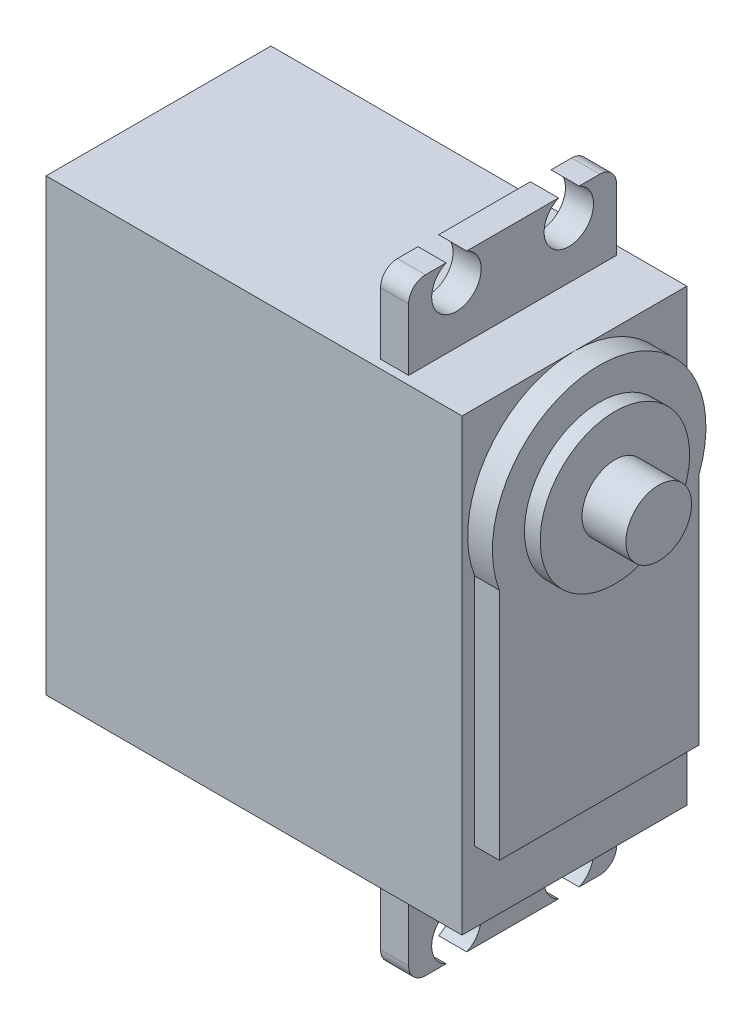
ISO-10303-21;
HEADER;
FILE_DESCRIPTION(('STEP AP214'),'2;1');
FILE_NAME('part.step','',(''),(''),'','','');
FILE_SCHEMA(('AUTOMOTIVE_DESIGN { 1 0 10303 214 1 1 1 1 }'));
ENDSEC;
DATA;
#1=APPLICATION_CONTEXT('core data for automotive mechanical design processes');
#2=APPLICATION_PROTOCOL_DEFINITION('international standard','automotive_design',2000,#1);
#3=PRODUCT_CONTEXT('',#1,'mechanical');
#4=PRODUCT('Part','Part','',(#3));
#5=PRODUCT_RELATED_PRODUCT_CATEGORY('part','',(#4));
#6=PRODUCT_DEFINITION_FORMATION('','',#4);
#7=PRODUCT_DEFINITION_CONTEXT('part definition',#1,'design');
#8=PRODUCT_DEFINITION('design','',#6,#7);
#9=PRODUCT_DEFINITION_SHAPE('','',#8);
#10=(LENGTH_UNIT() NAMED_UNIT(*) SI_UNIT(.MILLI.,.METRE.));
#11=(NAMED_UNIT(*) PLANE_ANGLE_UNIT() SI_UNIT($,.RADIAN.));
#12=(NAMED_UNIT(*) SI_UNIT($,.STERADIAN.) SOLID_ANGLE_UNIT());
#13=UNCERTAINTY_MEASURE_WITH_UNIT(LENGTH_MEASURE(1.E-05),#10,'distance_accuracy_value','');
#14=(GEOMETRIC_REPRESENTATION_CONTEXT(3) GLOBAL_UNCERTAINTY_ASSIGNED_CONTEXT((#13)) GLOBAL_UNIT_ASSIGNED_CONTEXT((#10,
#11,#12)) REPRESENTATION_CONTEXT('',''));
#15=CARTESIAN_POINT('',(0.,0.,0.));
#16=DIRECTION('',(0.,0.,1.));
#17=DIRECTION('',(1.,0.,0.));
#18=AXIS2_PLACEMENT_3D('',#15,#16,#17);
#19=CARTESIAN_POINT('',(18.5,20.,-20.));
#20=DIRECTION('',(1.,0.,0.));
#21=DIRECTION('',(0.,0.,-1.));
#22=AXIS2_PLACEMENT_3D('',#19,#20,#21);
#23=PLANE('',#22);
#24=CARTESIAN_POINT('',(18.5,10.5,-9.99999999999999));
#25=DIRECTION('',(1.,0.,0.));
#26=DIRECTION('',(0.,0.,-1.));
#27=AXIS2_PLACEMENT_3D('',#24,#25,#26);
#28=CIRCLE('',#27,9.5);
#29=CARTESIAN_POINT('',(18.5,7.11113957206849,-18.875));
#30=VERTEX_POINT('',#29);
#31=CARTESIAN_POINT('',(18.5,20.,-9.99999999999999));
#32=VERTEX_POINT('',#31);
#33=EDGE_CURVE('E279',#30,#32,#28,.T.);
#34=ORIENTED_EDGE('',*,*,#33,.F.);
#35=DIRECTION('',(0.,1.,0.));
#36=VECTOR('',#35,1.);
#37=CARTESIAN_POINT('',(18.5,-13.7,-18.875));
#38=LINE('',#37,#36);
#39=CARTESIAN_POINT('',(18.5,-13.7,-18.875));
#40=VERTEX_POINT('',#39);
#41=EDGE_CURVE('E265',#40,#30,#38,.T.);
#42=ORIENTED_EDGE('',*,*,#41,.F.);
#43=DIRECTION('',(0.,0.,-1.));
#44=VECTOR('',#43,1.);
#45=CARTESIAN_POINT('',(18.5,-13.7,-1.12499999999999));
#46=LINE('',#45,#44);
#47=CARTESIAN_POINT('',(18.5,-13.7,-1.12499999999999));
#48=VERTEX_POINT('',#47);
#49=EDGE_CURVE('E271',#48,#40,#46,.T.);
#50=ORIENTED_EDGE('',*,*,#49,.F.);
#51=DIRECTION('',(0.,-1.,0.));
#52=VECTOR('',#51,1.);
#53=CARTESIAN_POINT('',(18.5,-13.7,-1.12499999999999));
#54=LINE('',#53,#52);
#55=CARTESIAN_POINT('',(18.5,7.11113957206851,-1.12499999999999));
#56=VERTEX_POINT('',#55);
#57=EDGE_CURVE('E250',#56,#48,#54,.T.);
#58=ORIENTED_EDGE('',*,*,#57,.F.);
#59=EDGE_CURVE('E283',#32,#56,#28,.T.);
#60=ORIENTED_EDGE('',*,*,#59,.F.);
#61=DIRECTION('',(0.,0.,1.));
#62=VECTOR('',#61,1.);
#63=CARTESIAN_POINT('',(18.5,20.,-20.));
#64=LINE('',#63,#62);
#65=CARTESIAN_POINT('',(18.5,20.,0.));
#66=VERTEX_POINT('',#65);
#67=EDGE_CURVE('E413',#32,#66,#64,.T.);
#68=ORIENTED_EDGE('',*,*,#67,.T.);
#69=DIRECTION('',(0.,1.,0.));
#70=VECTOR('',#69,1.);
#71=CARTESIAN_POINT('',(18.5,20.,0.));
#72=LINE('',#71,#70);
#73=CARTESIAN_POINT('',(18.5,-20.,0.));
#74=VERTEX_POINT('',#73);
#75=EDGE_CURVE('E395',#74,#66,#72,.T.);
#76=ORIENTED_EDGE('',*,*,#75,.F.);
#77=DIRECTION('',(0.,0.,1.));
#78=VECTOR('',#77,1.);
#79=CARTESIAN_POINT('',(18.5,-20.,-20.));
#80=LINE('',#79,#78);
#81=CARTESIAN_POINT('',(18.5,-20.,-20.));
#82=VERTEX_POINT('',#81);
#83=EDGE_CURVE('E428',#82,#74,#80,.T.);
#84=ORIENTED_EDGE('',*,*,#83,.F.);
#85=DIRECTION('',(0.,1.,0.));
#86=VECTOR('',#85,1.);
#87=CARTESIAN_POINT('',(18.5,20.,-20.));
#88=LINE('',#87,#86);
#89=CARTESIAN_POINT('',(18.5,20.,-20.));
#90=VERTEX_POINT('',#89);
#91=EDGE_CURVE('E396',#82,#90,#88,.T.);
#92=ORIENTED_EDGE('',*,*,#91,.T.);
#93=EDGE_CURVE('E438',#90,#32,#64,.T.);
#94=ORIENTED_EDGE('',*,*,#93,.T.);
#95=EDGE_LOOP('',(#34,#42,#50,#58,#60,#68,#76,#84,#92,#94));
#96=FACE_BOUND('',#95,.T.);
#97=ADVANCED_FACE('F45',(#96),#23,.T.);
#98=CARTESIAN_POINT('',(20.7,10.5,-9.99999999999999));
#99=DIRECTION('',(-1.,0.,0.));
#100=DIRECTION('',(0.,0.,1.));
#101=AXIS2_PLACEMENT_3D('',#98,#99,#100);
#102=CYLINDRICAL_SURFACE('',#101,9.5);
#103=DIRECTION('',(-1.,0.,0.));
#104=VECTOR('',#103,1.);
#105=CARTESIAN_POINT('',(20.7,7.11113957206849,-18.875));
#106=LINE('',#105,#104);
#107=CARTESIAN_POINT('',(20.7,7.11113957206849,-18.875));
#108=VERTEX_POINT('',#107);
#109=EDGE_CURVE('E276',#30,#108,#106,.F.);
#110=ORIENTED_EDGE('',*,*,#109,.F.);
#111=ORIENTED_EDGE('',*,*,#33,.T.);
#112=ORIENTED_EDGE('',*,*,#59,.T.);
#113=DIRECTION('',(-1.,0.,0.));
#114=VECTOR('',#113,1.);
#115=CARTESIAN_POINT('',(20.7,7.11113957206851,-1.12499999999999));
#116=LINE('',#115,#114);
#117=CARTESIAN_POINT('',(20.7,7.11113957206851,-1.12499999999999));
#118=VERTEX_POINT('',#117);
#119=EDGE_CURVE('E254',#118,#56,#116,.T.);
#120=ORIENTED_EDGE('',*,*,#119,.F.);
#121=CARTESIAN_POINT('',(20.7,10.5,-9.99999999999999));
#122=DIRECTION('',(1.,0.,0.));
#123=DIRECTION('',(0.,0.,-1.));
#124=AXIS2_PLACEMENT_3D('',#121,#122,#123);
#125=CIRCLE('',#124,9.5);
#126=EDGE_CURVE('E241',#108,#118,#125,.T.);
#127=ORIENTED_EDGE('',*,*,#126,.F.);
#128=EDGE_LOOP('',(#110,#111,#112,#120,#127));
#129=FACE_BOUND('',#128,.T.);
#130=ADVANCED_FACE('F554',(#129),#102,.T.);
#131=CARTESIAN_POINT('',(13.,27.,-19.25));
#132=DIRECTION('',(0.,1.,0.));
#133=DIRECTION('',(-1.,0.,0.));
#134=AXIS2_PLACEMENT_3D('',#131,#132,#133);
#135=PLANE('',#134);
#136=DIRECTION('',(1.,0.,0.));
#137=VECTOR('',#136,1.);
#138=CARTESIAN_POINT('',(-18.501,27.,-14.0834848610088));
#139=LINE('',#138,#137);
#140=CARTESIAN_POINT('',(13.,27.,-14.0834848610088));
#141=VERTEX_POINT('',#140);
#142=CARTESIAN_POINT('',(10.5,27.,-14.0834848610088));
#143=VERTEX_POINT('',#142);
#144=EDGE_CURVE('E71',#141,#143,#139,.F.);
#145=ORIENTED_EDGE('',*,*,#144,.T.);
#146=DIRECTION('',(0.,0.,-1.));
#147=VECTOR('',#146,1.);
#148=CARTESIAN_POINT('',(10.5,27.,-19.25));
#149=LINE('',#148,#147);
#150=CARTESIAN_POINT('',(10.5,27.,-5.91651513899118));
#151=VERTEX_POINT('',#150);
#152=EDGE_CURVE('E371',#151,#143,#149,.T.);
#153=ORIENTED_EDGE('',*,*,#152,.F.);
#154=DIRECTION('',(1.,0.,0.));
#155=VECTOR('',#154,1.);
#156=CARTESIAN_POINT('',(-18.501,27.,-5.91651513899118));
#157=LINE('',#156,#155);
#158=CARTESIAN_POINT('',(13.,27.,-5.91651513899118));
#159=VERTEX_POINT('',#158);
#160=EDGE_CURVE('E314',#151,#159,#157,.T.);
#161=ORIENTED_EDGE('',*,*,#160,.T.);
#162=DIRECTION('',(0.,0.,-1.));
#163=VECTOR('',#162,1.);
#164=CARTESIAN_POINT('',(13.,27.,-19.25));
#165=LINE('',#164,#163);
#166=EDGE_CURVE('E351',#159,#141,#165,.T.);
#167=ORIENTED_EDGE('',*,*,#166,.T.);
#168=EDGE_LOOP('',(#145,#153,#161,#167));
#169=FACE_BOUND('',#168,.T.);
#170=ADVANCED_FACE('F561',(#169),#135,.T.);
#171=DIRECTION('',(1.,0.,0.));
#172=VECTOR('',#171,1.);
#173=CARTESIAN_POINT('',(-18.501,27.,-4.08348486100881));
#174=LINE('',#173,#172);
#175=CARTESIAN_POINT('',(13.,27.,-4.08348486100881));
#176=VERTEX_POINT('',#175);
#177=CARTESIAN_POINT('',(10.5,27.,-4.08348486100881));
#178=VERTEX_POINT('',#177);
#179=EDGE_CURVE('E330',#176,#178,#174,.F.);
#180=ORIENTED_EDGE('',*,*,#179,.T.);
#181=CARTESIAN_POINT('',(10.5,27.,-2.25));
#182=VERTEX_POINT('',#181);
#183=EDGE_CURVE('E366',#182,#178,#149,.T.);
#184=ORIENTED_EDGE('',*,*,#183,.F.);
#185=DIRECTION('',(-1.,0.,0.));
#186=VECTOR('',#185,1.);
#187=CARTESIAN_POINT('',(13.,27.,-2.25));
#188=LINE('',#187,#186);
#189=CARTESIAN_POINT('',(13.,27.,-2.25));
#190=VERTEX_POINT('',#189);
#191=EDGE_CURVE('E483',#182,#190,#188,.F.);
#192=ORIENTED_EDGE('',*,*,#191,.T.);
#193=EDGE_CURVE('E346',#190,#176,#165,.T.);
#194=ORIENTED_EDGE('',*,*,#193,.T.);
#195=EDGE_LOOP('',(#180,#184,#192,#194));
#196=FACE_BOUND('',#195,.T.);
#197=ADVANCED_FACE('F663',(#196),#135,.T.);
#198=CARTESIAN_POINT('',(13.,-27.,-19.25));
#199=DIRECTION('',(0.,-1.,0.));
#200=DIRECTION('',(1.,0.,0.));
#201=AXIS2_PLACEMENT_3D('',#198,#199,#200);
#202=PLANE('',#201);
#203=DIRECTION('',(1.,0.,0.));
#204=VECTOR('',#203,1.);
#205=CARTESIAN_POINT('',(-18.501,-27.,-5.91651513899117));
#206=LINE('',#205,#204);
#207=CARTESIAN_POINT('',(13.,-27.,-5.91651513899117));
#208=VERTEX_POINT('',#207);
#209=CARTESIAN_POINT('',(10.5,-27.,-5.91651513899117));
#210=VERTEX_POINT('',#209);
#211=EDGE_CURVE('E320',#208,#210,#206,.F.);
#212=ORIENTED_EDGE('',*,*,#211,.T.);
#213=DIRECTION('',(0.,0.,1.));
#214=VECTOR('',#213,1.);
#215=CARTESIAN_POINT('',(10.5,-27.,-19.25));
#216=LINE('',#215,#214);
#217=CARTESIAN_POINT('',(10.5,-27.,-14.0834848610088));
#218=VERTEX_POINT('',#217);
#219=EDGE_CURVE('E380',#218,#210,#216,.T.);
#220=ORIENTED_EDGE('',*,*,#219,.F.);
#221=DIRECTION('',(1.,0.,0.));
#222=VECTOR('',#221,1.);
#223=CARTESIAN_POINT('',(-18.501,-27.,-14.0834848610088));
#224=LINE('',#223,#222);
#225=CARTESIAN_POINT('',(13.,-27.,-14.0834848610088));
#226=VERTEX_POINT('',#225);
#227=EDGE_CURVE('E296',#218,#226,#224,.T.);
#228=ORIENTED_EDGE('',*,*,#227,.T.);
#229=DIRECTION('',(0.,0.,1.));
#230=VECTOR('',#229,1.);
#231=CARTESIAN_POINT('',(13.,-27.,-19.25));
#232=LINE('',#231,#230);
#233=EDGE_CURVE('E361',#226,#208,#232,.T.);
#234=ORIENTED_EDGE('',*,*,#233,.T.);
#235=EDGE_LOOP('',(#212,#220,#228,#234));
#236=FACE_BOUND('',#235,.T.);
#237=ADVANCED_FACE('F653',(#236),#202,.T.);
#238=DIRECTION('',(1.,0.,0.));
#239=VECTOR('',#238,1.);
#240=CARTESIAN_POINT('',(-18.501,-27.,-15.9165151389912));
#241=LINE('',#240,#239);
#242=CARTESIAN_POINT('',(13.,-27.,-15.9165151389912));
#243=VERTEX_POINT('',#242);
#244=CARTESIAN_POINT('',(10.5,-27.,-15.9165151389912));
#245=VERTEX_POINT('',#244);
#246=EDGE_CURVE('E292',#243,#245,#241,.F.);
#247=ORIENTED_EDGE('',*,*,#246,.T.);
#248=CARTESIAN_POINT('',(10.5,-27.,-17.75));
#249=VERTEX_POINT('',#248);
#250=EDGE_CURVE('E376',#249,#245,#216,.T.);
#251=ORIENTED_EDGE('',*,*,#250,.F.);
#252=DIRECTION('',(-1.,0.,0.));
#253=VECTOR('',#252,1.);
#254=CARTESIAN_POINT('',(13.,-27.,-17.75));
#255=LINE('',#254,#253);
#256=CARTESIAN_POINT('',(13.,-27.,-17.75));
#257=VERTEX_POINT('',#256);
#258=EDGE_CURVE('E456',#249,#257,#255,.F.);
#259=ORIENTED_EDGE('',*,*,#258,.T.);
#260=EDGE_CURVE('E356',#257,#243,#232,.T.);
#261=ORIENTED_EDGE('',*,*,#260,.T.);
#262=EDGE_LOOP('',(#247,#251,#259,#261));
#263=FACE_BOUND('',#262,.T.);
#264=ADVANCED_FACE('F654',(#263),#202,.T.);
#265=CARTESIAN_POINT('',(-18.5,-20.,-20.));
#266=DIRECTION('',(0.,-1.,0.));
#267=DIRECTION('',(0.,0.,-1.));
#268=AXIS2_PLACEMENT_3D('',#265,#266,#267);
#269=PLANE('',#268);
#270=DIRECTION('',(0.,0.,1.));
#271=VECTOR('',#270,1.);
#272=CARTESIAN_POINT('',(13.,-20.,-20.));
#273=LINE('',#272,#271);
#274=CARTESIAN_POINT('',(13.,-20.,-19.25));
#275=VERTEX_POINT('',#274);
#276=CARTESIAN_POINT('',(13.,-20.,-0.749999999999994));
#277=VERTEX_POINT('',#276);
#278=EDGE_CURVE('E384',#275,#277,#273,.T.);
#279=ORIENTED_EDGE('',*,*,#278,.F.);
#280=DIRECTION('',(1.,0.,0.));
#281=VECTOR('',#280,1.);
#282=CARTESIAN_POINT('',(-18.5,-20.,-19.25));
#283=LINE('',#282,#281);
#284=CARTESIAN_POINT('',(10.5,-20.,-19.25));
#285=VERTEX_POINT('',#284);
#286=EDGE_CURVE('E388',#285,#275,#283,.T.);
#287=ORIENTED_EDGE('',*,*,#286,.F.);
#288=DIRECTION('',(0.,0.,1.));
#289=VECTOR('',#288,1.);
#290=CARTESIAN_POINT('',(10.5,-20.,-20.));
#291=LINE('',#290,#289);
#292=CARTESIAN_POINT('',(10.5,-20.,-0.749999999999994));
#293=VERTEX_POINT('',#292);
#294=EDGE_CURVE('E360',#285,#293,#291,.T.);
#295=ORIENTED_EDGE('',*,*,#294,.T.);
#296=DIRECTION('',(-1.,0.,0.));
#297=VECTOR('',#296,1.);
#298=CARTESIAN_POINT('',(-18.5,-20.,-0.749999999999994));
#299=LINE('',#298,#297);
#300=EDGE_CURVE('E391',#277,#293,#299,.T.);
#301=ORIENTED_EDGE('',*,*,#300,.F.);
#302=EDGE_LOOP('',(#279,#287,#295,#301));
#303=FACE_BOUND('',#302,.T.);
#304=DIRECTION('',(1.,0.,0.));
#305=VECTOR('',#304,1.);
#306=CARTESIAN_POINT('',(-18.5,-20.,0.));
#307=LINE('',#306,#305);
#308=CARTESIAN_POINT('',(-18.5,-20.,0.));
#309=VERTEX_POINT('',#308);
#310=EDGE_CURVE('E401',#309,#74,#307,.T.);
#311=ORIENTED_EDGE('',*,*,#310,.F.);
#312=DIRECTION('',(0.,0.,1.));
#313=VECTOR('',#312,1.);
#314=CARTESIAN_POINT('',(-18.5,-20.,-20.));
#315=LINE('',#314,#313);
#316=CARTESIAN_POINT('',(-18.5,-20.,-20.));
#317=VERTEX_POINT('',#316);
#318=EDGE_CURVE('E432',#317,#309,#315,.T.);
#319=ORIENTED_EDGE('',*,*,#318,.F.);
#320=DIRECTION('',(1.,0.,0.));
#321=VECTOR('',#320,1.);
#322=CARTESIAN_POINT('',(-18.5,-20.,-20.));
#323=LINE('',#322,#321);
#324=EDGE_CURVE('E409',#317,#82,#323,.T.);
#325=ORIENTED_EDGE('',*,*,#324,.T.);
#326=ORIENTED_EDGE('',*,*,#83,.T.);
#327=EDGE_LOOP('',(#311,#319,#325,#326));
#328=FACE_BOUND('',#327,.T.);
#329=ADVANCED_FACE('F674',(#303,#328),#269,.T.);
#330=CARTESIAN_POINT('',(-18.5,20.,-20.));
#331=DIRECTION('',(-1.,0.,0.));
#332=DIRECTION('',(0.,-1.,0.));
#333=AXIS2_PLACEMENT_3D('',#330,#331,#332);
#334=PLANE('',#333);
#335=DIRECTION('',(0.,-1.,0.));
#336=VECTOR('',#335,1.);
#337=CARTESIAN_POINT('',(-18.5,20.,0.));
#338=LINE('',#337,#336);
#339=CARTESIAN_POINT('',(-18.5,20.,0.));
#340=VERTEX_POINT('',#339);
#341=EDGE_CURVE('E421',#340,#309,#338,.T.);
#342=ORIENTED_EDGE('',*,*,#341,.F.);
#343=DIRECTION('',(0.,0.,1.));
#344=VECTOR('',#343,1.);
#345=CARTESIAN_POINT('',(-18.5,20.,-20.));
#346=LINE('',#345,#344);
#347=CARTESIAN_POINT('',(-18.5,20.,-20.));
#348=VERTEX_POINT('',#347);
#349=EDGE_CURVE('E435',#348,#340,#346,.T.);
#350=ORIENTED_EDGE('',*,*,#349,.F.);
#351=DIRECTION('',(0.,-1.,0.));
#352=VECTOR('',#351,1.);
#353=CARTESIAN_POINT('',(-18.5,20.,-20.));
#354=LINE('',#353,#352);
#355=EDGE_CURVE('E405',#348,#317,#354,.T.);
#356=ORIENTED_EDGE('',*,*,#355,.T.);
#357=ORIENTED_EDGE('',*,*,#318,.T.);
#358=EDGE_LOOP('',(#342,#350,#356,#357));
#359=FACE_BOUND('',#358,.T.);
#360=ADVANCED_FACE('F676',(#359),#334,.T.);
#361=CARTESIAN_POINT('',(-18.5,20.,-20.));
#362=DIRECTION('',(0.,1.,0.));
#363=DIRECTION('',(0.,0.,1.));
#364=AXIS2_PLACEMENT_3D('',#361,#362,#363);
#365=PLANE('',#364);
#366=DIRECTION('',(0.,0.,-1.));
#367=VECTOR('',#366,1.);
#368=CARTESIAN_POINT('',(13.,20.,-20.));
#369=LINE('',#368,#367);
#370=CARTESIAN_POINT('',(13.,20.,-0.749999999999994));
#371=VERTEX_POINT('',#370);
#372=CARTESIAN_POINT('',(13.,20.,-19.25));
#373=VERTEX_POINT('',#372);
#374=EDGE_CURVE('E452',#371,#373,#369,.T.);
#375=ORIENTED_EDGE('',*,*,#374,.F.);
#376=DIRECTION('',(1.,0.,0.));
#377=VECTOR('',#376,1.);
#378=CARTESIAN_POINT('',(-18.5,20.,-0.749999999999994));
#379=LINE('',#378,#377);
#380=CARTESIAN_POINT('',(10.5,20.,-0.749999999999994));
#381=VERTEX_POINT('',#380);
#382=EDGE_CURVE('E449',#381,#371,#379,.T.);
#383=ORIENTED_EDGE('',*,*,#382,.F.);
#384=DIRECTION('',(0.,0.,-1.));
#385=VECTOR('',#384,1.);
#386=CARTESIAN_POINT('',(10.5,20.,-20.));
#387=LINE('',#386,#385);
#388=CARTESIAN_POINT('',(10.5,20.,-19.25));
#389=VERTEX_POINT('',#388);
#390=EDGE_CURVE('E431',#381,#389,#387,.T.);
#391=ORIENTED_EDGE('',*,*,#390,.T.);
#392=DIRECTION('',(-1.,0.,0.));
#393=VECTOR('',#392,1.);
#394=CARTESIAN_POINT('',(-18.5,20.,-19.25));
#395=LINE('',#394,#393);
#396=EDGE_CURVE('E445',#373,#389,#395,.T.);
#397=ORIENTED_EDGE('',*,*,#396,.F.);
#398=EDGE_LOOP('',(#375,#383,#391,#397));
#399=FACE_BOUND('',#398,.T.);
#400=DIRECTION('',(-1.,0.,0.));
#401=VECTOR('',#400,1.);
#402=CARTESIAN_POINT('',(-18.5,20.,0.));
#403=LINE('',#402,#401);
#404=EDGE_CURVE('E417',#66,#340,#403,.T.);
#405=ORIENTED_EDGE('',*,*,#404,.F.);
#406=ORIENTED_EDGE('',*,*,#67,.F.);
#407=ORIENTED_EDGE('',*,*,#93,.F.);
#408=DIRECTION('',(-1.,0.,0.));
#409=VECTOR('',#408,1.);
#410=CARTESIAN_POINT('',(-18.5,20.,-20.));
#411=LINE('',#410,#409);
#412=EDGE_CURVE('E400',#90,#348,#411,.T.);
#413=ORIENTED_EDGE('',*,*,#412,.T.);
#414=ORIENTED_EDGE('',*,*,#349,.T.);
#415=EDGE_LOOP('',(#405,#406,#407,#413,#414));
#416=FACE_BOUND('',#415,.T.);
#417=ADVANCED_FACE('F567',(#399,#416),#365,.T.);
#418=CARTESIAN_POINT('',(0.,0.,-20.));
#419=DIRECTION('',(0.,0.,1.));
#420=DIRECTION('',(1.,0.,0.));
#421=AXIS2_PLACEMENT_3D('',#418,#419,#420);
#422=PLANE('',#421);
#423=ORIENTED_EDGE('',*,*,#91,.F.);
#424=ORIENTED_EDGE('',*,*,#324,.F.);
#425=ORIENTED_EDGE('',*,*,#355,.F.);
#426=ORIENTED_EDGE('',*,*,#412,.F.);
#427=EDGE_LOOP('',(#423,#424,#425,#426));
#428=FACE_BOUND('',#427,.T.);
#429=ADVANCED_FACE('F667',(#428),#422,.F.);
#430=CARTESIAN_POINT('',(0.,0.,0.));
#431=DIRECTION('',(0.,0.,1.));
#432=DIRECTION('',(1.,0.,0.));
#433=AXIS2_PLACEMENT_3D('',#430,#431,#432);
#434=PLANE('',#433);
#435=ORIENTED_EDGE('',*,*,#75,.T.);
#436=ORIENTED_EDGE('',*,*,#404,.T.);
#437=ORIENTED_EDGE('',*,*,#341,.T.);
#438=ORIENTED_EDGE('',*,*,#310,.T.);
#439=EDGE_LOOP('',(#435,#436,#437,#438));
#440=FACE_BOUND('',#439,.T.);
#441=ADVANCED_FACE('F662',(#440),#434,.T.);
#442=DIRECTION('',(1.,0.,0.));
#443=VECTOR('',#442,1.);
#444=CARTESIAN_POINT('',(-18.501,27.,-15.9165151389912));
#445=LINE('',#444,#443);
#446=CARTESIAN_POINT('',(10.5,27.,-15.9165151389912));
#447=VERTEX_POINT('',#446);
#448=CARTESIAN_POINT('',(13.,27.,-15.9165151389912));
#449=VERTEX_POINT('',#448);
#450=EDGE_CURVE('E310',#447,#449,#445,.T.);
#451=ORIENTED_EDGE('',*,*,#450,.T.);
#452=CARTESIAN_POINT('',(13.,27.,-17.75));
#453=VERTEX_POINT('',#452);
#454=EDGE_CURVE('E344',#449,#453,#165,.T.);
#455=ORIENTED_EDGE('',*,*,#454,.T.);
#456=DIRECTION('',(-1.,0.,0.));
#457=VECTOR('',#456,1.);
#458=CARTESIAN_POINT('',(13.,27.,-17.75));
#459=LINE('',#458,#457);
#460=CARTESIAN_POINT('',(10.5,27.,-17.75));
#461=VERTEX_POINT('',#460);
#462=EDGE_CURVE('E486',#453,#461,#459,.T.);
#463=ORIENTED_EDGE('',*,*,#462,.T.);
#464=EDGE_CURVE('E365',#447,#461,#149,.T.);
#465=ORIENTED_EDGE('',*,*,#464,.F.);
#466=EDGE_LOOP('',(#451,#455,#463,#465));
#467=FACE_BOUND('',#466,.T.);
#468=ADVANCED_FACE('F589',(#467),#135,.T.);
#469=CARTESIAN_POINT('',(10.5,0.,0.));
#470=DIRECTION('',(1.,0.,0.));
#471=DIRECTION('',(0.,1.,0.));
#472=AXIS2_PLACEMENT_3D('',#469,#470,#471);
#473=PLANE('',#472);
#474=ORIENTED_EDGE('',*,*,#152,.T.);
#475=CARTESIAN_POINT('',(10.5,25.,-15.));
#476=DIRECTION('',(1.,0.,0.));
#477=DIRECTION('',(0.,1.,0.));
#478=AXIS2_PLACEMENT_3D('',#475,#476,#477);
#479=CIRCLE('',#478,2.2);
#480=EDGE_CURVE('E301',#447,#143,#479,.F.);
#481=ORIENTED_EDGE('',*,*,#480,.F.);
#482=ORIENTED_EDGE('',*,*,#464,.T.);
#483=CARTESIAN_POINT('',(10.5,25.5,-17.75));
#484=DIRECTION('',(1.,0.,0.));
#485=DIRECTION('',(0.,1.,0.));
#486=AXIS2_PLACEMENT_3D('',#483,#484,#485);
#487=CIRCLE('',#486,1.5);
#488=CARTESIAN_POINT('',(10.5,25.5,-19.25));
#489=VERTEX_POINT('',#488);
#490=EDGE_CURVE('E493',#461,#489,#487,.F.);
#491=ORIENTED_EDGE('',*,*,#490,.T.);
#492=DIRECTION('',(0.,-1.,0.));
#493=VECTOR('',#492,1.);
#494=CARTESIAN_POINT('',(10.5,-27.,-19.25));
#495=LINE('',#494,#493);
#496=EDGE_CURVE('E372',#489,#389,#495,.T.);
#497=ORIENTED_EDGE('',*,*,#496,.T.);
#498=ORIENTED_EDGE('',*,*,#390,.F.);
#499=DIRECTION('',(0.,1.,0.));
#500=VECTOR('',#499,1.);
#501=CARTESIAN_POINT('',(10.5,-27.,-0.749999999999994));
#502=LINE('',#501,#500);
#503=CARTESIAN_POINT('',(10.5,25.5,-0.749999999999994));
#504=VERTEX_POINT('',#503);
#505=EDGE_CURVE('E340',#381,#504,#502,.T.);
#506=ORIENTED_EDGE('',*,*,#505,.T.);
#507=CARTESIAN_POINT('',(10.5,25.5,-2.24999999999999));
#508=DIRECTION('',(1.,0.,0.));
#509=DIRECTION('',(0.,1.,0.));
#510=AXIS2_PLACEMENT_3D('',#507,#508,#509);
#511=CIRCLE('',#510,1.5);
#512=EDGE_CURVE('E490',#504,#182,#511,.F.);
#513=ORIENTED_EDGE('',*,*,#512,.T.);
#514=ORIENTED_EDGE('',*,*,#183,.T.);
#515=CARTESIAN_POINT('',(10.5,25.,-4.99999999999999));
#516=DIRECTION('',(1.,0.,0.));
#517=DIRECTION('',(0.,1.,0.));
#518=AXIS2_PLACEMENT_3D('',#515,#516,#517);
#519=CIRCLE('',#518,2.2);
#520=EDGE_CURVE('E337',#151,#178,#519,.F.);
#521=ORIENTED_EDGE('',*,*,#520,.F.);
#522=EDGE_LOOP('',(#474,#481,#482,#491,#497,#498,#506,#513,#514,#521));
#523=FACE_BOUND('',#522,.T.);
#524=ADVANCED_FACE('F603',(#523),#473,.F.);
#525=CARTESIAN_POINT('',(13.,0.,0.));
#526=DIRECTION('',(1.,0.,0.));
#527=DIRECTION('',(0.,1.,0.));
#528=AXIS2_PLACEMENT_3D('',#525,#526,#527);
#529=PLANE('',#528);
#530=CARTESIAN_POINT('',(13.,25.,-15.));
#531=DIRECTION('',(1.,0.,0.));
#532=DIRECTION('',(0.,1.,0.));
#533=AXIS2_PLACEMENT_3D('',#530,#531,#532);
#534=CIRCLE('',#533,2.2);
#535=EDGE_CURVE('E304',#141,#449,#534,.T.);
#536=ORIENTED_EDGE('',*,*,#535,.F.);
#537=ORIENTED_EDGE('',*,*,#166,.F.);
#538=CARTESIAN_POINT('',(13.,25.,-4.99999999999999));
#539=DIRECTION('',(1.,0.,0.));
#540=DIRECTION('',(0.,1.,0.));
#541=AXIS2_PLACEMENT_3D('',#538,#539,#540);
#542=CIRCLE('',#541,2.2);
#543=EDGE_CURVE('E334',#176,#159,#542,.T.);
#544=ORIENTED_EDGE('',*,*,#543,.F.);
#545=ORIENTED_EDGE('',*,*,#193,.F.);
#546=CARTESIAN_POINT('',(13.,25.5,-2.24999999999999));
#547=DIRECTION('',(1.,0.,0.));
#548=DIRECTION('',(0.,1.,0.));
#549=AXIS2_PLACEMENT_3D('',#546,#547,#548);
#550=CIRCLE('',#549,1.5);
#551=CARTESIAN_POINT('',(13.,25.5,-0.749999999999994));
#552=VERTEX_POINT('',#551);
#553=EDGE_CURVE('E499',#190,#552,#550,.T.);
#554=ORIENTED_EDGE('',*,*,#553,.T.);
#555=DIRECTION('',(0.,1.,0.));
#556=VECTOR('',#555,1.);
#557=CARTESIAN_POINT('',(13.,-27.,-0.749999999999994));
#558=LINE('',#557,#556);
#559=EDGE_CURVE('E345',#371,#552,#558,.T.);
#560=ORIENTED_EDGE('',*,*,#559,.F.);
#561=ORIENTED_EDGE('',*,*,#374,.T.);
#562=DIRECTION('',(0.,-1.,0.));
#563=VECTOR('',#562,1.);
#564=CARTESIAN_POINT('',(13.,-27.,-19.25));
#565=LINE('',#564,#563);
#566=CARTESIAN_POINT('',(13.,25.5,-19.25));
#567=VERTEX_POINT('',#566);
#568=EDGE_CURVE('E352',#567,#373,#565,.T.);
#569=ORIENTED_EDGE('',*,*,#568,.F.);
#570=CARTESIAN_POINT('',(13.,25.5,-17.75));
#571=DIRECTION('',(1.,0.,0.));
#572=DIRECTION('',(0.,1.,0.));
#573=AXIS2_PLACEMENT_3D('',#570,#571,#572);
#574=CIRCLE('',#573,1.5);
#575=EDGE_CURVE('E501',#567,#453,#574,.T.);
#576=ORIENTED_EDGE('',*,*,#575,.T.);
#577=ORIENTED_EDGE('',*,*,#454,.F.);
#578=EDGE_LOOP('',(#536,#537,#544,#545,#554,#560,#561,#569,#576,#577));
#579=FACE_BOUND('',#578,.T.);
#580=ADVANCED_FACE('F598',(#579),#529,.T.);
#581=CARTESIAN_POINT('',(13.,-27.,-19.25));
#582=DIRECTION('',(0.,0.,-1.));
#583=DIRECTION('',(-1.,0.,0.));
#584=AXIS2_PLACEMENT_3D('',#581,#582,#583);
#585=PLANE('',#584);
#586=ORIENTED_EDGE('',*,*,#496,.F.);
#587=DIRECTION('',(-1.,0.,0.));
#588=VECTOR('',#587,1.);
#589=CARTESIAN_POINT('',(13.,25.5,-19.25));
#590=LINE('',#589,#588);
#591=EDGE_CURVE('E496',#489,#567,#590,.F.);
#592=ORIENTED_EDGE('',*,*,#591,.T.);
#593=ORIENTED_EDGE('',*,*,#568,.T.);
#594=ORIENTED_EDGE('',*,*,#396,.T.);
#595=EDGE_LOOP('',(#586,#592,#593,#594));
#596=FACE_BOUND('',#595,.T.);
#597=ADVANCED_FACE('F645',(#596),#585,.T.);
#598=CARTESIAN_POINT('',(13.,-27.,-0.749999999999994));
#599=DIRECTION('',(0.,0.,1.));
#600=DIRECTION('',(1.,0.,0.));
#601=AXIS2_PLACEMENT_3D('',#598,#599,#600);
#602=PLANE('',#601);
#603=ORIENTED_EDGE('',*,*,#559,.T.);
#604=DIRECTION('',(-1.,0.,0.));
#605=VECTOR('',#604,1.);
#606=CARTESIAN_POINT('',(13.,25.5,-0.749999999999994));
#607=LINE('',#606,#605);
#608=EDGE_CURVE('E49',#552,#504,#607,.T.);
#609=ORIENTED_EDGE('',*,*,#608,.T.);
#610=ORIENTED_EDGE('',*,*,#505,.F.);
#611=ORIENTED_EDGE('',*,*,#382,.T.);
#612=EDGE_LOOP('',(#603,#609,#610,#611));
#613=FACE_BOUND('',#612,.T.);
#614=ADVANCED_FACE('F657',(#613),#602,.T.);
#615=CARTESIAN_POINT('',(10.5,-25.5,-0.749999999999994));
#616=VERTEX_POINT('',#615);
#617=EDGE_CURVE('E362',#616,#293,#502,.T.);
#618=ORIENTED_EDGE('',*,*,#617,.F.);
#619=DIRECTION('',(-1.,0.,0.));
#620=VECTOR('',#619,1.);
#621=CARTESIAN_POINT('',(13.,-25.5,-0.749999999999994));
#622=LINE('',#621,#620);
#623=CARTESIAN_POINT('',(13.,-25.5,-0.749999999999994));
#624=VERTEX_POINT('',#623);
#625=EDGE_CURVE('E469',#616,#624,#622,.F.);
#626=ORIENTED_EDGE('',*,*,#625,.T.);
#627=EDGE_CURVE('E341',#624,#277,#558,.T.);
#628=ORIENTED_EDGE('',*,*,#627,.T.);
#629=ORIENTED_EDGE('',*,*,#300,.T.);
#630=EDGE_LOOP('',(#618,#626,#628,#629));
#631=FACE_BOUND('',#630,.T.);
#632=ADVANCED_FACE('F666',(#631),#602,.T.);
#633=CARTESIAN_POINT('',(13.,-25.5,-19.25));
#634=VERTEX_POINT('',#633);
#635=EDGE_CURVE('E350',#275,#634,#565,.T.);
#636=ORIENTED_EDGE('',*,*,#635,.T.);
#637=DIRECTION('',(-1.,0.,0.));
#638=VECTOR('',#637,1.);
#639=CARTESIAN_POINT('',(13.,-25.5,-19.25));
#640=LINE('',#639,#638);
#641=CARTESIAN_POINT('',(10.5,-25.5,-19.25));
#642=VERTEX_POINT('',#641);
#643=EDGE_CURVE('E479',#634,#642,#640,.T.);
#644=ORIENTED_EDGE('',*,*,#643,.T.);
#645=EDGE_CURVE('E370',#285,#642,#495,.T.);
#646=ORIENTED_EDGE('',*,*,#645,.F.);
#647=ORIENTED_EDGE('',*,*,#286,.T.);
#648=EDGE_LOOP('',(#636,#644,#646,#647));
#649=FACE_BOUND('',#648,.T.);
#650=ADVANCED_FACE('F659',(#649),#585,.T.);
#651=CARTESIAN_POINT('',(13.,-25.,-4.99999999999999));
#652=DIRECTION('',(1.,0.,0.));
#653=DIRECTION('',(0.,1.,0.));
#654=AXIS2_PLACEMENT_3D('',#651,#652,#653);
#655=CIRCLE('',#654,2.2);
#656=CARTESIAN_POINT('',(13.,-27.,-4.08348486100881));
#657=VERTEX_POINT('',#656);
#658=EDGE_CURVE('E317',#208,#657,#655,.T.);
#659=ORIENTED_EDGE('',*,*,#658,.F.);
#660=ORIENTED_EDGE('',*,*,#233,.F.);
#661=CARTESIAN_POINT('',(13.,-25.,-15.));
#662=DIRECTION('',(1.,0.,0.));
#663=DIRECTION('',(0.,1.,0.));
#664=AXIS2_PLACEMENT_3D('',#661,#662,#663);
#665=CIRCLE('',#664,2.20000000000001);
#666=EDGE_CURVE('E289',#243,#226,#665,.T.);
#667=ORIENTED_EDGE('',*,*,#666,.F.);
#668=ORIENTED_EDGE('',*,*,#260,.F.);
#669=CARTESIAN_POINT('',(13.,-25.5,-17.75));
#670=DIRECTION('',(1.,0.,0.));
#671=DIRECTION('',(0.,1.,0.));
#672=AXIS2_PLACEMENT_3D('',#669,#670,#671);
#673=CIRCLE('',#672,1.5);
#674=EDGE_CURVE('E472',#257,#634,#673,.T.);
#675=ORIENTED_EDGE('',*,*,#674,.T.);
#676=ORIENTED_EDGE('',*,*,#635,.F.);
#677=ORIENTED_EDGE('',*,*,#278,.T.);
#678=ORIENTED_EDGE('',*,*,#627,.F.);
#679=CARTESIAN_POINT('',(13.,-25.5,-2.25));
#680=DIRECTION('',(1.,0.,0.));
#681=DIRECTION('',(0.,1.,0.));
#682=AXIS2_PLACEMENT_3D('',#679,#680,#681);
#683=CIRCLE('',#682,1.5);
#684=CARTESIAN_POINT('',(13.,-27.,-2.25));
#685=VERTEX_POINT('',#684);
#686=EDGE_CURVE('E475',#624,#685,#683,.T.);
#687=ORIENTED_EDGE('',*,*,#686,.T.);
#688=EDGE_CURVE('E355',#657,#685,#232,.T.);
#689=ORIENTED_EDGE('',*,*,#688,.F.);
#690=EDGE_LOOP('',(#659,#660,#667,#668,#675,#676,#677,#678,#687,#689));
#691=FACE_BOUND('',#690,.T.);
#692=ADVANCED_FACE('F646',(#691),#529,.T.);
#693=ORIENTED_EDGE('',*,*,#219,.T.);
#694=CARTESIAN_POINT('',(10.5,-25.,-4.99999999999999));
#695=DIRECTION('',(1.,0.,0.));
#696=DIRECTION('',(0.,1.,0.));
#697=AXIS2_PLACEMENT_3D('',#694,#695,#696);
#698=CIRCLE('',#697,2.2);
#699=CARTESIAN_POINT('',(10.5,-27.,-4.08348486100881));
#700=VERTEX_POINT('',#699);
#701=EDGE_CURVE('E300',#700,#210,#698,.F.);
#702=ORIENTED_EDGE('',*,*,#701,.F.);
#703=CARTESIAN_POINT('',(10.5,-27.,-2.25));
#704=VERTEX_POINT('',#703);
#705=EDGE_CURVE('E375',#700,#704,#216,.T.);
#706=ORIENTED_EDGE('',*,*,#705,.T.);
#707=CARTESIAN_POINT('',(10.5,-25.5,-2.25));
#708=DIRECTION('',(1.,0.,0.));
#709=DIRECTION('',(0.,1.,0.));
#710=AXIS2_PLACEMENT_3D('',#707,#708,#709);
#711=CIRCLE('',#710,1.5);
#712=EDGE_CURVE('E466',#704,#616,#711,.F.);
#713=ORIENTED_EDGE('',*,*,#712,.T.);
#714=ORIENTED_EDGE('',*,*,#617,.T.);
#715=ORIENTED_EDGE('',*,*,#294,.F.);
#716=ORIENTED_EDGE('',*,*,#645,.T.);
#717=CARTESIAN_POINT('',(10.5,-25.5,-17.75));
#718=DIRECTION('',(1.,0.,0.));
#719=DIRECTION('',(0.,1.,0.));
#720=AXIS2_PLACEMENT_3D('',#717,#718,#719);
#721=CIRCLE('',#720,1.5);
#722=EDGE_CURVE('E463',#642,#249,#721,.F.);
#723=ORIENTED_EDGE('',*,*,#722,.T.);
#724=ORIENTED_EDGE('',*,*,#250,.T.);
#725=CARTESIAN_POINT('',(10.5,-25.,-15.));
#726=DIRECTION('',(1.,0.,0.));
#727=DIRECTION('',(0.,1.,0.));
#728=AXIS2_PLACEMENT_3D('',#725,#726,#727);
#729=CIRCLE('',#728,2.20000000000001);
#730=EDGE_CURVE('E282',#218,#245,#729,.F.);
#731=ORIENTED_EDGE('',*,*,#730,.F.);
#732=EDGE_LOOP('',(#693,#702,#706,#713,#714,#715,#716,#723,#724,#731));
#733=FACE_BOUND('',#732,.T.);
#734=ADVANCED_FACE('F649',(#733),#473,.F.);
#735=DIRECTION('',(1.,0.,0.));
#736=VECTOR('',#735,1.);
#737=CARTESIAN_POINT('',(-18.501,-27.,-4.08348486100881));
#738=LINE('',#737,#736);
#739=EDGE_CURVE('E305',#700,#657,#738,.T.);
#740=ORIENTED_EDGE('',*,*,#739,.T.);
#741=ORIENTED_EDGE('',*,*,#688,.T.);
#742=DIRECTION('',(-1.,0.,0.));
#743=VECTOR('',#742,1.);
#744=CARTESIAN_POINT('',(13.,-27.,-2.25));
#745=LINE('',#744,#743);
#746=EDGE_CURVE('E459',#685,#704,#745,.T.);
#747=ORIENTED_EDGE('',*,*,#746,.T.);
#748=ORIENTED_EDGE('',*,*,#705,.F.);
#749=EDGE_LOOP('',(#740,#741,#747,#748));
#750=FACE_BOUND('',#749,.T.);
#751=ADVANCED_FACE('F573',(#750),#202,.T.);
#752=CARTESIAN_POINT('',(13.,-25.5,-2.25));
#753=DIRECTION('',(-1.,0.,0.));
#754=DIRECTION('',(0.,-1.,0.));
#755=AXIS2_PLACEMENT_3D('',#752,#753,#754);
#756=CYLINDRICAL_SURFACE('',#755,1.5);
#757=ORIENTED_EDGE('',*,*,#686,.F.);
#758=ORIENTED_EDGE('',*,*,#625,.F.);
#759=ORIENTED_EDGE('',*,*,#712,.F.);
#760=ORIENTED_EDGE('',*,*,#746,.F.);
#761=EDGE_LOOP('',(#757,#758,#759,#760));
#762=FACE_BOUND('',#761,.T.);
#763=ADVANCED_FACE('F569',(#762),#756,.T.);
#764=CARTESIAN_POINT('',(13.,-25.5,-17.75));
#765=DIRECTION('',(-1.,0.,0.));
#766=DIRECTION('',(0.,-1.,0.));
#767=AXIS2_PLACEMENT_3D('',#764,#765,#766);
#768=CYLINDRICAL_SURFACE('',#767,1.5);
#769=ORIENTED_EDGE('',*,*,#674,.F.);
#770=ORIENTED_EDGE('',*,*,#258,.F.);
#771=ORIENTED_EDGE('',*,*,#722,.F.);
#772=ORIENTED_EDGE('',*,*,#643,.F.);
#773=EDGE_LOOP('',(#769,#770,#771,#772));
#774=FACE_BOUND('',#773,.T.);
#775=ADVANCED_FACE('F572',(#774),#768,.T.);
#776=CARTESIAN_POINT('',(13.,25.5,-17.75));
#777=DIRECTION('',(-1.,0.,0.));
#778=DIRECTION('',(0.,-1.,0.));
#779=AXIS2_PLACEMENT_3D('',#776,#777,#778);
#780=CYLINDRICAL_SURFACE('',#779,1.5);
#781=ORIENTED_EDGE('',*,*,#575,.F.);
#782=ORIENTED_EDGE('',*,*,#591,.F.);
#783=ORIENTED_EDGE('',*,*,#490,.F.);
#784=ORIENTED_EDGE('',*,*,#462,.F.);
#785=EDGE_LOOP('',(#781,#782,#783,#784));
#786=FACE_BOUND('',#785,.T.);
#787=ADVANCED_FACE('F576',(#786),#780,.T.);
#788=CARTESIAN_POINT('',(13.,25.5,-2.24999999999999));
#789=DIRECTION('',(-1.,0.,0.));
#790=DIRECTION('',(0.,-1.,0.));
#791=AXIS2_PLACEMENT_3D('',#788,#789,#790);
#792=CYLINDRICAL_SURFACE('',#791,1.5);
#793=ORIENTED_EDGE('',*,*,#553,.F.);
#794=ORIENTED_EDGE('',*,*,#191,.F.);
#795=ORIENTED_EDGE('',*,*,#512,.F.);
#796=ORIENTED_EDGE('',*,*,#608,.F.);
#797=EDGE_LOOP('',(#793,#794,#795,#796));
#798=FACE_BOUND('',#797,.T.);
#799=ADVANCED_FACE('F47',(#798),#792,.T.);
#800=CARTESIAN_POINT('',(-18.501,-25.,-15.));
#801=DIRECTION('',(1.,0.,0.));
#802=DIRECTION('',(0.,1.,0.));
#803=AXIS2_PLACEMENT_3D('',#800,#801,#802);
#804=CYLINDRICAL_SURFACE('',#803,2.20000000000001);
#805=ORIENTED_EDGE('',*,*,#666,.T.);
#806=ORIENTED_EDGE('',*,*,#227,.F.);
#807=ORIENTED_EDGE('',*,*,#730,.T.);
#808=ORIENTED_EDGE('',*,*,#246,.F.);
#809=EDGE_LOOP('',(#805,#806,#807,#808));
#810=FACE_BOUND('',#809,.T.);
#811=ADVANCED_FACE('F583',(#810),#804,.F.);
#812=CARTESIAN_POINT('',(-18.501,-25.,-4.99999999999999));
#813=DIRECTION('',(1.,0.,0.));
#814=DIRECTION('',(0.,1.,0.));
#815=AXIS2_PLACEMENT_3D('',#812,#813,#814);
#816=CYLINDRICAL_SURFACE('',#815,2.2);
#817=ORIENTED_EDGE('',*,*,#658,.T.);
#818=ORIENTED_EDGE('',*,*,#739,.F.);
#819=ORIENTED_EDGE('',*,*,#701,.T.);
#820=ORIENTED_EDGE('',*,*,#211,.F.);
#821=EDGE_LOOP('',(#817,#818,#819,#820));
#822=FACE_BOUND('',#821,.T.);
#823=ADVANCED_FACE('F632',(#822),#816,.F.);
#824=CARTESIAN_POINT('',(-18.501,25.,-4.99999999999999));
#825=DIRECTION('',(1.,0.,0.));
#826=DIRECTION('',(0.,1.,0.));
#827=AXIS2_PLACEMENT_3D('',#824,#825,#826);
#828=CYLINDRICAL_SURFACE('',#827,2.2);
#829=ORIENTED_EDGE('',*,*,#543,.T.);
#830=ORIENTED_EDGE('',*,*,#160,.F.);
#831=ORIENTED_EDGE('',*,*,#520,.T.);
#832=ORIENTED_EDGE('',*,*,#179,.F.);
#833=EDGE_LOOP('',(#829,#830,#831,#832));
#834=FACE_BOUND('',#833,.T.);
#835=ADVANCED_FACE('F636',(#834),#828,.F.);
#836=CARTESIAN_POINT('',(-18.501,25.,-15.));
#837=DIRECTION('',(1.,0.,0.));
#838=DIRECTION('',(0.,1.,0.));
#839=AXIS2_PLACEMENT_3D('',#836,#837,#838);
#840=CYLINDRICAL_SURFACE('',#839,2.2);
#841=ORIENTED_EDGE('',*,*,#535,.T.);
#842=ORIENTED_EDGE('',*,*,#450,.F.);
#843=ORIENTED_EDGE('',*,*,#480,.T.);
#844=ORIENTED_EDGE('',*,*,#144,.F.);
#845=EDGE_LOOP('',(#841,#842,#843,#844));
#846=FACE_BOUND('',#845,.T.);
#847=ADVANCED_FACE('F600',(#846),#840,.F.);
#848=CARTESIAN_POINT('',(20.7,10.5,-9.99999999999999));
#849=DIRECTION('',(1.,0.,0.));
#850=DIRECTION('',(0.,0.,-1.));
#851=AXIS2_PLACEMENT_3D('',#848,#849,#850);
#852=PLANE('',#851);
#853=CARTESIAN_POINT('',(20.7,10.5,-9.99999999999999));
#854=DIRECTION('',(1.,0.,0.));
#855=DIRECTION('',(0.,0.,-1.));
#856=AXIS2_PLACEMENT_3D('',#853,#854,#855);
#857=CIRCLE('',#856,6.65);
#858=CARTESIAN_POINT('',(20.7,10.5,-16.65));
#859=VERTEX_POINT('',#858);
#860=EDGE_CURVE('E55',#859,#859,#857,.T.);
#861=ORIENTED_EDGE('',*,*,#860,.F.);
#862=EDGE_LOOP('',(#861));
#863=FACE_BOUND('',#862,.T.);
#864=ORIENTED_EDGE('',*,*,#126,.T.);
#865=DIRECTION('',(0.,-1.,0.));
#866=VECTOR('',#865,1.);
#867=CARTESIAN_POINT('',(20.7,-13.7,-1.12499999999999));
#868=LINE('',#867,#866);
#869=CARTESIAN_POINT('',(20.7,-13.7,-1.12499999999999));
#870=VERTEX_POINT('',#869);
#871=EDGE_CURVE('E234',#118,#870,#868,.T.);
#872=ORIENTED_EDGE('',*,*,#871,.T.);
#873=DIRECTION('',(0.,0.,-1.));
#874=VECTOR('',#873,1.);
#875=CARTESIAN_POINT('',(20.7,-13.7,-1.12499999999999));
#876=LINE('',#875,#874);
#877=CARTESIAN_POINT('',(20.7,-13.7,-18.875));
#878=VERTEX_POINT('',#877);
#879=EDGE_CURVE('E238',#870,#878,#876,.T.);
#880=ORIENTED_EDGE('',*,*,#879,.T.);
#881=DIRECTION('',(0.,1.,0.));
#882=VECTOR('',#881,1.);
#883=CARTESIAN_POINT('',(20.7,-13.7,-18.875));
#884=LINE('',#883,#882);
#885=EDGE_CURVE('E63',#878,#108,#884,.T.);
#886=ORIENTED_EDGE('',*,*,#885,.T.);
#887=EDGE_LOOP('',(#864,#872,#880,#886));
#888=FACE_BOUND('',#887,.T.);
#889=ADVANCED_FACE('F236',(#863,#888),#852,.T.);
#890=CARTESIAN_POINT('',(20.7,-13.7,-18.875));
#891=DIRECTION('',(0.,0.,1.));
#892=DIRECTION('',(1.,0.,0.));
#893=AXIS2_PLACEMENT_3D('',#890,#891,#892);
#894=PLANE('',#893);
#895=ORIENTED_EDGE('',*,*,#41,.T.);
#896=ORIENTED_EDGE('',*,*,#109,.T.);
#897=ORIENTED_EDGE('',*,*,#885,.F.);
#898=DIRECTION('',(-1.,0.,0.));
#899=VECTOR('',#898,1.);
#900=CARTESIAN_POINT('',(20.7,-13.7,-18.875));
#901=LINE('',#900,#899);
#902=EDGE_CURVE('E255',#878,#40,#901,.T.);
#903=ORIENTED_EDGE('',*,*,#902,.T.);
#904=EDGE_LOOP('',(#895,#896,#897,#903));
#905=FACE_BOUND('',#904,.T.);
#906=ADVANCED_FACE('F620',(#905),#894,.F.);
#907=CARTESIAN_POINT('',(20.7,-13.7,-1.12499999999999));
#908=DIRECTION('',(0.,0.,-1.));
#909=DIRECTION('',(-1.,0.,0.));
#910=AXIS2_PLACEMENT_3D('',#907,#908,#909);
#911=PLANE('',#910);
#912=ORIENTED_EDGE('',*,*,#871,.F.);
#913=ORIENTED_EDGE('',*,*,#119,.T.);
#914=ORIENTED_EDGE('',*,*,#57,.T.);
#915=DIRECTION('',(-1.,0.,0.));
#916=VECTOR('',#915,1.);
#917=CARTESIAN_POINT('',(20.7,-13.7,-1.12499999999999));
#918=LINE('',#917,#916);
#919=EDGE_CURVE('E247',#870,#48,#918,.T.);
#920=ORIENTED_EDGE('',*,*,#919,.F.);
#921=EDGE_LOOP('',(#912,#913,#914,#920));
#922=FACE_BOUND('',#921,.T.);
#923=ADVANCED_FACE('F248',(#922),#911,.F.);
#924=CARTESIAN_POINT('',(20.7,-13.7,-1.12499999999999));
#925=DIRECTION('',(0.,1.,0.));
#926=DIRECTION('',(0.,0.,1.));
#927=AXIS2_PLACEMENT_3D('',#924,#925,#926);
#928=PLANE('',#927);
#929=ORIENTED_EDGE('',*,*,#49,.T.);
#930=ORIENTED_EDGE('',*,*,#902,.F.);
#931=ORIENTED_EDGE('',*,*,#879,.F.);
#932=ORIENTED_EDGE('',*,*,#919,.T.);
#933=EDGE_LOOP('',(#929,#930,#931,#932));
#934=FACE_BOUND('',#933,.T.);
#935=ADVANCED_FACE('F257',(#934),#928,.F.);
#936=CARTESIAN_POINT('',(22.1,10.5,-9.99999999999999));
#937=DIRECTION('',(-1.,0.,0.));
#938=DIRECTION('',(0.,0.,1.));
#939=AXIS2_PLACEMENT_3D('',#936,#937,#938);
#940=CYLINDRICAL_SURFACE('',#939,6.65);
#941=CARTESIAN_POINT('',(22.1,10.5,-9.99999999999999));
#942=DIRECTION('',(1.,0.,0.));
#943=DIRECTION('',(0.,0.,-1.));
#944=AXIS2_PLACEMENT_3D('',#941,#942,#943);
#945=CIRCLE('',#944,6.65);
#946=CARTESIAN_POINT('',(22.1,10.5,-16.65));
#947=VERTEX_POINT('',#946);
#948=EDGE_CURVE('E268',#947,#947,#945,.T.);
#949=ORIENTED_EDGE('',*,*,#948,.F.);
#950=EDGE_LOOP('',(#949));
#951=FACE_BOUND('',#950,.T.);
#952=ORIENTED_EDGE('',*,*,#860,.T.);
#953=EDGE_LOOP('',(#952));
#954=FACE_BOUND('',#953,.T.);
#955=ADVANCED_FACE('F542',(#951,#954),#940,.T.);
#956=CARTESIAN_POINT('',(22.1,10.5,-9.99999999999999));
#957=DIRECTION('',(1.,0.,0.));
#958=DIRECTION('',(0.,0.,-1.));
#959=AXIS2_PLACEMENT_3D('',#956,#957,#958);
#960=PLANE('',#959);
#961=CARTESIAN_POINT('',(22.1,10.5,-9.99999999999999));
#962=DIRECTION('',(1.,0.,0.));
#963=DIRECTION('',(0.,0.,-1.));
#964=AXIS2_PLACEMENT_3D('',#961,#962,#963);
#965=CIRCLE('',#964,2.925);
#966=CARTESIAN_POINT('',(22.1,10.5,-12.925));
#967=VERTEX_POINT('',#966);
#968=EDGE_CURVE('E11',#967,#967,#965,.T.);
#969=ORIENTED_EDGE('',*,*,#968,.F.);
#970=EDGE_LOOP('',(#969));
#971=FACE_BOUND('',#970,.T.);
#972=ORIENTED_EDGE('',*,*,#948,.T.);
#973=EDGE_LOOP('',(#972));
#974=FACE_BOUND('',#973,.T.);
#975=ADVANCED_FACE('F536',(#971,#974),#960,.T.);
#976=CARTESIAN_POINT('',(26.,10.5,-9.99999999999999));
#977=DIRECTION('',(-1.,0.,0.));
#978=DIRECTION('',(0.,0.,1.));
#979=AXIS2_PLACEMENT_3D('',#976,#977,#978);
#980=CYLINDRICAL_SURFACE('',#979,2.925);
#981=CARTESIAN_POINT('',(26.,10.5,-9.99999999999999));
#982=DIRECTION('',(1.,0.,0.));
#983=DIRECTION('',(0.,0.,-1.));
#984=AXIS2_PLACEMENT_3D('',#981,#982,#983);
#985=CIRCLE('',#984,2.925);
#986=CARTESIAN_POINT('',(26.,10.5,-12.925));
#987=VERTEX_POINT('',#986);
#988=EDGE_CURVE('E526',#987,#987,#985,.T.);
#989=ORIENTED_EDGE('',*,*,#988,.F.);
#990=EDGE_LOOP('',(#989));
#991=FACE_BOUND('',#990,.T.);
#992=ORIENTED_EDGE('',*,*,#968,.T.);
#993=EDGE_LOOP('',(#992));
#994=FACE_BOUND('',#993,.T.);
#995=ADVANCED_FACE('F533',(#991,#994),#980,.T.);
#996=CARTESIAN_POINT('',(26.,10.5,-9.99999999999999));
#997=DIRECTION('',(1.,0.,0.));
#998=DIRECTION('',(0.,0.,-1.));
#999=AXIS2_PLACEMENT_3D('',#996,#997,#998);
#1000=PLANE('',#999);
#1001=ORIENTED_EDGE('',*,*,#988,.T.);
#1002=EDGE_LOOP('',(#1001));
#1003=FACE_BOUND('',#1002,.T.);
#1004=ADVANCED_FACE('F531',(#1003),#1000,.T.);
#1005=CLOSED_SHELL('',(#97,#130,#170,#197,#237,#264,#329,#360,#417,#429,#441,#468,#524,#580,
#597,#614,#632,#650,#692,#734,#751,#763,#775,#787,#799,#811,#823,#835,#847,#889,#906,#923,#935,
#955,#975,#995,#1004));
#1006=MANIFOLD_SOLID_BREP('B2',#1005);
#1007=ADVANCED_BREP_SHAPE_REPRESENTATION('',(#18,#1006),#14);
#1008=SHAPE_DEFINITION_REPRESENTATION(#9,#1007);
ENDSEC;
END-ISO-10303-21;
